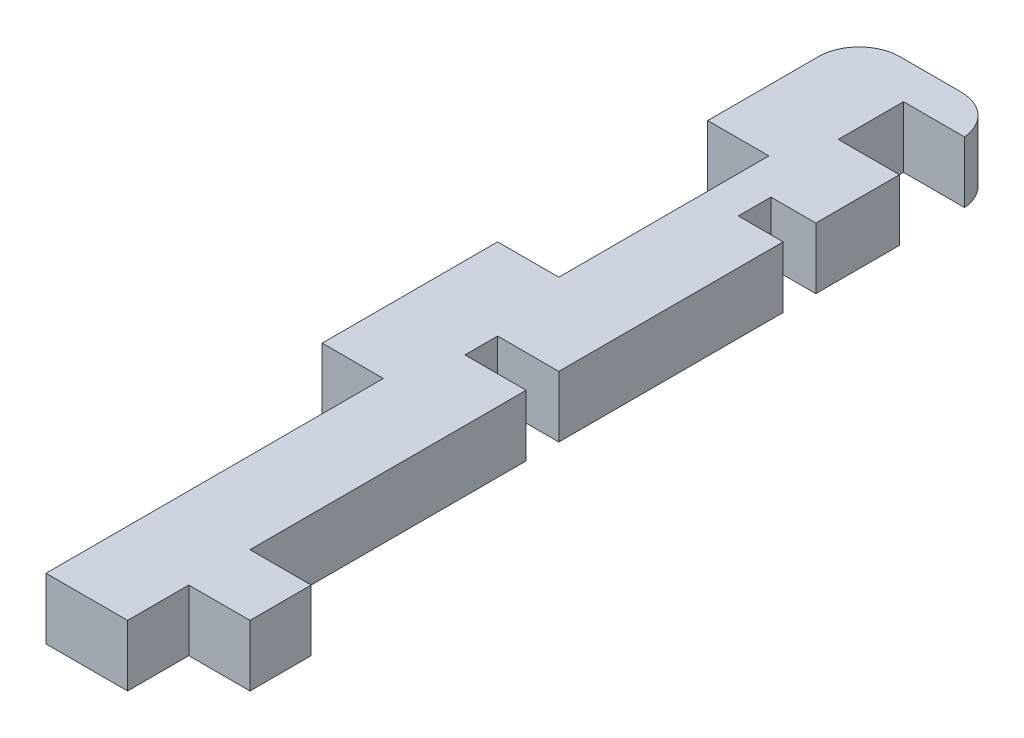
ISO-10303-21;
HEADER;
FILE_DESCRIPTION(('STEP AP214'),'2;1');
FILE_NAME('part.step','',(''),(''),'','','');
FILE_SCHEMA(('AUTOMOTIVE_DESIGN { 1 0 10303 214 1 1 1 1 }'));
ENDSEC;
DATA;
#1=APPLICATION_CONTEXT('core data for automotive mechanical design processes');
#2=APPLICATION_PROTOCOL_DEFINITION('international standard','automotive_design',2000,#1);
#3=PRODUCT_CONTEXT('',#1,'mechanical');
#4=PRODUCT('Part','Part','',(#3));
#5=PRODUCT_RELATED_PRODUCT_CATEGORY('part','',(#4));
#6=PRODUCT_DEFINITION_FORMATION('','',#4);
#7=PRODUCT_DEFINITION_CONTEXT('part definition',#1,'design');
#8=PRODUCT_DEFINITION('design','',#6,#7);
#9=PRODUCT_DEFINITION_SHAPE('','',#8);
#10=(LENGTH_UNIT() NAMED_UNIT(*) SI_UNIT(.MILLI.,.METRE.));
#11=(NAMED_UNIT(*) PLANE_ANGLE_UNIT() SI_UNIT($,.RADIAN.));
#12=(NAMED_UNIT(*) SI_UNIT($,.STERADIAN.) SOLID_ANGLE_UNIT());
#13=UNCERTAINTY_MEASURE_WITH_UNIT(LENGTH_MEASURE(1.E-05),#10,'distance_accuracy_value','');
#14=(GEOMETRIC_REPRESENTATION_CONTEXT(3) GLOBAL_UNCERTAINTY_ASSIGNED_CONTEXT((#13)) GLOBAL_UNIT_ASSIGNED_CONTEXT((#10,
#11,#12)) REPRESENTATION_CONTEXT('',''));
#15=CARTESIAN_POINT('',(0.,0.,0.));
#16=DIRECTION('',(0.,0.,1.));
#17=DIRECTION('',(1.,0.,0.));
#18=AXIS2_PLACEMENT_3D('',#15,#16,#17);
#19=CARTESIAN_POINT('',(-3.99999999999999,55.,3.3012479750596));
#20=DIRECTION('',(1.,0.,0.));
#21=DIRECTION('',(0.,0.,-1.));
#22=AXIS2_PLACEMENT_3D('',#19,#20,#21);
#23=PLANE('',#22);
#24=DIRECTION('',(0.,0.,-1.));
#25=VECTOR('',#24,1.);
#26=CARTESIAN_POINT('',(-3.99999999999999,58.,3.3012479750596));
#27=LINE('',#26,#25);
#28=CARTESIAN_POINT('',(-3.99999999999999,58.,4.6));
#29=VERTEX_POINT('',#28);
#30=CARTESIAN_POINT('',(-3.99999999999999,58.,-4.));
#31=VERTEX_POINT('',#30);
#32=EDGE_CURVE('E309',#29,#31,#27,.T.);
#33=ORIENTED_EDGE('',*,*,#32,.T.);
#34=DIRECTION('',(0.,1.,0.));
#35=VECTOR('',#34,1.);
#36=CARTESIAN_POINT('',(-3.99999999999999,55.,-4.));
#37=LINE('',#36,#35);
#38=CARTESIAN_POINT('',(-3.99999999999999,55.,-4.));
#39=VERTEX_POINT('',#38);
#40=EDGE_CURVE('E398',#39,#31,#37,.T.);
#41=ORIENTED_EDGE('',*,*,#40,.F.);
#42=DIRECTION('',(0.,0.,-1.));
#43=VECTOR('',#42,1.);
#44=CARTESIAN_POINT('',(-3.99999999999999,55.,3.3012479750596));
#45=LINE('',#44,#43);
#46=CARTESIAN_POINT('',(-3.99999999999999,55.,4.6));
#47=VERTEX_POINT('',#46);
#48=EDGE_CURVE('E310',#47,#39,#45,.T.);
#49=ORIENTED_EDGE('',*,*,#48,.F.);
#50=DIRECTION('',(0.,1.,0.));
#51=VECTOR('',#50,1.);
#52=CARTESIAN_POINT('',(-3.99999999999999,33.0497927116849,4.6));
#53=LINE('',#52,#51);
#54=EDGE_CURVE('E289',#47,#29,#53,.T.);
#55=ORIENTED_EDGE('',*,*,#54,.T.);
#56=EDGE_LOOP('',(#33,#41,#49,#55));
#57=FACE_BOUND('',#56,.T.);
#58=ADVANCED_FACE('F32',(#57),#23,.F.);
#59=CARTESIAN_POINT('',(-3.99999999999999,55.,-4.));
#60=DIRECTION('',(0.,0.,1.));
#61=DIRECTION('',(1.,0.,0.));
#62=AXIS2_PLACEMENT_3D('',#59,#60,#61);
#63=PLANE('',#62);
#64=DIRECTION('',(1.,0.,0.));
#65=VECTOR('',#64,1.);
#66=CARTESIAN_POINT('',(-3.99999999999999,58.,-4.));
#67=LINE('',#66,#65);
#68=CARTESIAN_POINT('',(-0.999999999999992,58.,-4.));
#69=VERTEX_POINT('',#68);
#70=EDGE_CURVE('E345',#31,#69,#67,.T.);
#71=ORIENTED_EDGE('',*,*,#70,.T.);
#72=DIRECTION('',(0.,1.,0.));
#73=VECTOR('',#72,1.);
#74=CARTESIAN_POINT('',(-0.999999999999993,55.,-4.));
#75=LINE('',#74,#73);
#76=CARTESIAN_POINT('',(-0.999999999999993,55.,-4.));
#77=VERTEX_POINT('',#76);
#78=EDGE_CURVE('E395',#77,#69,#75,.T.);
#79=ORIENTED_EDGE('',*,*,#78,.F.);
#80=DIRECTION('',(1.,0.,0.));
#81=VECTOR('',#80,1.);
#82=CARTESIAN_POINT('',(-3.99999999999999,55.,-4.));
#83=LINE('',#82,#81);
#84=EDGE_CURVE('E313',#39,#77,#83,.T.);
#85=ORIENTED_EDGE('',*,*,#84,.F.);
#86=ORIENTED_EDGE('',*,*,#40,.T.);
#87=EDGE_LOOP('',(#71,#79,#85,#86));
#88=FACE_BOUND('',#87,.T.);
#89=ADVANCED_FACE('F442',(#88),#63,.F.);
#90=CARTESIAN_POINT('',(-0.999999999999993,55.,-4.));
#91=DIRECTION('',(1.,0.,0.));
#92=DIRECTION('',(0.,1.,0.));
#93=AXIS2_PLACEMENT_3D('',#90,#91,#92);
#94=PLANE('',#93);
#95=DIRECTION('',(0.,0.,-1.));
#96=VECTOR('',#95,1.);
#97=CARTESIAN_POINT('',(-0.999999999999992,58.,-4.));
#98=LINE('',#97,#96);
#99=CARTESIAN_POINT('',(-0.999999999999992,58.,-14.3));
#100=VERTEX_POINT('',#99);
#101=EDGE_CURVE('E347',#69,#100,#98,.T.);
#102=ORIENTED_EDGE('',*,*,#101,.T.);
#103=DIRECTION('',(0.,1.,0.));
#104=VECTOR('',#103,1.);
#105=CARTESIAN_POINT('',(-0.999999999999993,55.,-14.3));
#106=LINE('',#105,#104);
#107=CARTESIAN_POINT('',(-0.999999999999993,55.,-14.3));
#108=VERTEX_POINT('',#107);
#109=EDGE_CURVE('E392',#108,#100,#106,.T.);
#110=ORIENTED_EDGE('',*,*,#109,.F.);
#111=DIRECTION('',(0.,0.,-1.));
#112=VECTOR('',#111,1.);
#113=CARTESIAN_POINT('',(-0.999999999999993,55.,-4.));
#114=LINE('',#113,#112);
#115=EDGE_CURVE('E316',#77,#108,#114,.T.);
#116=ORIENTED_EDGE('',*,*,#115,.F.);
#117=ORIENTED_EDGE('',*,*,#78,.T.);
#118=EDGE_LOOP('',(#102,#110,#116,#117));
#119=FACE_BOUND('',#118,.T.);
#120=ADVANCED_FACE('F438',(#119),#94,.F.);
#121=CARTESIAN_POINT('',(-0.999999999999993,55.,-14.3));
#122=DIRECTION('',(0.,0.,-1.));
#123=DIRECTION('',(-1.,0.,0.));
#124=AXIS2_PLACEMENT_3D('',#121,#122,#123);
#125=PLANE('',#124);
#126=DIRECTION('',(-1.,0.,0.));
#127=VECTOR('',#126,1.);
#128=CARTESIAN_POINT('',(-0.999999999999992,58.,-14.3));
#129=LINE('',#128,#127);
#130=CARTESIAN_POINT('',(-3.99999999999999,58.,-14.3));
#131=VERTEX_POINT('',#130);
#132=EDGE_CURVE('E349',#100,#131,#129,.T.);
#133=ORIENTED_EDGE('',*,*,#132,.T.);
#134=DIRECTION('',(0.,1.,0.));
#135=VECTOR('',#134,1.);
#136=CARTESIAN_POINT('',(-3.99999999999999,55.,-14.3));
#137=LINE('',#136,#135);
#138=CARTESIAN_POINT('',(-3.99999999999999,55.,-14.3));
#139=VERTEX_POINT('',#138);
#140=EDGE_CURVE('E389',#139,#131,#137,.T.);
#141=ORIENTED_EDGE('',*,*,#140,.F.);
#142=DIRECTION('',(-1.,0.,0.));
#143=VECTOR('',#142,1.);
#144=CARTESIAN_POINT('',(-0.999999999999993,55.,-14.3));
#145=LINE('',#144,#143);
#146=EDGE_CURVE('E318',#108,#139,#145,.T.);
#147=ORIENTED_EDGE('',*,*,#146,.F.);
#148=ORIENTED_EDGE('',*,*,#109,.T.);
#149=EDGE_LOOP('',(#133,#141,#147,#148));
#150=FACE_BOUND('',#149,.T.);
#151=ADVANCED_FACE('F434',(#150),#125,.F.);
#152=CARTESIAN_POINT('',(-3.99999999999999,55.,-14.3));
#153=DIRECTION('',(1.,0.,0.));
#154=DIRECTION('',(0.,1.,0.));
#155=AXIS2_PLACEMENT_3D('',#152,#153,#154);
#156=PLANE('',#155);
#157=DIRECTION('',(0.,0.,-1.));
#158=VECTOR('',#157,1.);
#159=CARTESIAN_POINT('',(-3.99999999999999,58.,-14.3));
#160=LINE('',#159,#158);
#161=CARTESIAN_POINT('',(-3.99999999999999,58.,-19.7231702245226));
#162=VERTEX_POINT('',#161);
#163=EDGE_CURVE('E351',#131,#162,#160,.T.);
#164=ORIENTED_EDGE('',*,*,#163,.T.);
#165=DIRECTION('',(0.,1.,0.));
#166=VECTOR('',#165,1.);
#167=CARTESIAN_POINT('',(-3.99999999999999,55.,-19.7231702245226));
#168=LINE('',#167,#166);
#169=CARTESIAN_POINT('',(-3.99999999999999,55.,-19.7231702245226));
#170=VERTEX_POINT('',#169);
#171=EDGE_CURVE('E55',#162,#170,#168,.F.);
#172=ORIENTED_EDGE('',*,*,#171,.T.);
#173=DIRECTION('',(0.,0.,-1.));
#174=VECTOR('',#173,1.);
#175=CARTESIAN_POINT('',(-3.99999999999999,55.,-14.3));
#176=LINE('',#175,#174);
#177=EDGE_CURVE('E320',#139,#170,#176,.T.);
#178=ORIENTED_EDGE('',*,*,#177,.F.);
#179=ORIENTED_EDGE('',*,*,#140,.T.);
#180=EDGE_LOOP('',(#164,#172,#178,#179));
#181=FACE_BOUND('',#180,.T.);
#182=ADVANCED_FACE('F430',(#181),#156,.F.);
#183=CARTESIAN_POINT('',(-3.99999999999999,55.,-21.7231702245226));
#184=DIRECTION('',(0.,0.,1.));
#185=DIRECTION('',(1.,0.,0.));
#186=AXIS2_PLACEMENT_3D('',#183,#184,#185);
#187=PLANE('',#186);
#188=DIRECTION('',(1.,0.,0.));
#189=VECTOR('',#188,1.);
#190=CARTESIAN_POINT('',(-3.99999999999999,55.,-21.7231702245226));
#191=LINE('',#190,#189);
#192=CARTESIAN_POINT('',(-1.99999999999999,55.,-21.7231702245226));
#193=VERTEX_POINT('',#192);
#194=CARTESIAN_POINT('',(1.00147624842734,55.,-21.7231702245226));
#195=VERTEX_POINT('',#194);
#196=EDGE_CURVE('E322',#193,#195,#191,.T.);
#197=ORIENTED_EDGE('',*,*,#196,.F.);
#198=DIRECTION('',(0.,1.,0.));
#199=VECTOR('',#198,1.);
#200=CARTESIAN_POINT('',(-1.99999999999999,55.,-21.7231702245226));
#201=LINE('',#200,#199);
#202=CARTESIAN_POINT('',(-1.99999999999999,58.,-21.7231702245226));
#203=VERTEX_POINT('',#202);
#204=EDGE_CURVE('E403',#193,#203,#201,.T.);
#205=ORIENTED_EDGE('',*,*,#204,.T.);
#206=DIRECTION('',(1.,0.,0.));
#207=VECTOR('',#206,1.);
#208=CARTESIAN_POINT('',(-3.99999999999999,58.,-21.7231702245226));
#209=LINE('',#208,#207);
#210=CARTESIAN_POINT('',(1.00147624842734,58.,-21.7231702245226));
#211=VERTEX_POINT('',#210);
#212=EDGE_CURVE('E224',#203,#211,#209,.T.);
#213=ORIENTED_EDGE('',*,*,#212,.T.);
#214=DIRECTION('',(0.,-1.,0.));
#215=VECTOR('',#214,1.);
#216=CARTESIAN_POINT('',(1.00147624842734,55.,-21.7231702245226));
#217=LINE('',#216,#215);
#218=EDGE_CURVE('E401',#211,#195,#217,.T.);
#219=ORIENTED_EDGE('',*,*,#218,.T.);
#220=EDGE_LOOP('',(#197,#205,#213,#219));
#221=FACE_BOUND('',#220,.T.);
#222=ADVANCED_FACE('F424',(#221),#187,.F.);
#223=CARTESIAN_POINT('',(0.,55.,-19.8));
#224=DIRECTION('',(-1.,0.,0.));
#225=DIRECTION('',(0.,-1.,0.));
#226=AXIS2_PLACEMENT_3D('',#223,#224,#225);
#227=PLANE('',#226);
#228=DIRECTION('',(0.,0.,1.));
#229=VECTOR('',#228,1.);
#230=CARTESIAN_POINT('',(0.,58.,-19.8));
#231=LINE('',#230,#229);
#232=CARTESIAN_POINT('',(0.,58.,-19.9));
#233=VERTEX_POINT('',#232);
#234=CARTESIAN_POINT('',(0.,58.,-16.7));
#235=VERTEX_POINT('',#234);
#236=EDGE_CURVE('E213',#233,#235,#231,.T.);
#237=ORIENTED_EDGE('',*,*,#236,.T.);
#238=DIRECTION('',(0.,-1.,0.));
#239=VECTOR('',#238,1.);
#240=CARTESIAN_POINT('',(0.,72.14,-16.7));
#241=LINE('',#240,#239);
#242=CARTESIAN_POINT('',(0.,55.,-16.7));
#243=VERTEX_POINT('',#242);
#244=EDGE_CURVE('E232',#235,#243,#241,.T.);
#245=ORIENTED_EDGE('',*,*,#244,.T.);
#246=DIRECTION('',(0.,0.,1.));
#247=VECTOR('',#246,1.);
#248=CARTESIAN_POINT('',(0.,55.,-19.8));
#249=LINE('',#248,#247);
#250=CARTESIAN_POINT('',(0.,55.,-19.9));
#251=VERTEX_POINT('',#250);
#252=EDGE_CURVE('E231',#251,#243,#249,.T.);
#253=ORIENTED_EDGE('',*,*,#252,.F.);
#254=DIRECTION('',(0.,-1.,0.));
#255=VECTOR('',#254,1.);
#256=CARTESIAN_POINT('',(0.,72.14,-19.9));
#257=LINE('',#256,#255);
#258=EDGE_CURVE('E227',#233,#251,#257,.T.);
#259=ORIENTED_EDGE('',*,*,#258,.F.);
#260=EDGE_LOOP('',(#237,#245,#253,#259));
#261=FACE_BOUND('',#260,.T.);
#262=ADVANCED_FACE('F230',(#261),#227,.F.);
#263=CARTESIAN_POINT('',(3.00000000000001,55.,-16.8));
#264=DIRECTION('',(-1.,0.,0.));
#265=DIRECTION('',(0.,-1.,0.));
#266=AXIS2_PLACEMENT_3D('',#263,#264,#265);
#267=PLANE('',#266);
#268=DIRECTION('',(0.,0.,1.));
#269=VECTOR('',#268,1.);
#270=CARTESIAN_POINT('',(3.00000000000001,55.,-16.8));
#271=LINE('',#270,#269);
#272=CARTESIAN_POINT('',(3.,55.,-16.7));
#273=VERTEX_POINT('',#272);
#274=CARTESIAN_POINT('',(3.00000000000001,55.,-12.6));
#275=VERTEX_POINT('',#274);
#276=EDGE_CURVE('E326',#273,#275,#271,.T.);
#277=ORIENTED_EDGE('',*,*,#276,.F.);
#278=DIRECTION('',(0.,-1.,0.));
#279=VECTOR('',#278,1.);
#280=CARTESIAN_POINT('',(3.,72.14,-16.7));
#281=LINE('',#280,#279);
#282=CARTESIAN_POINT('',(3.,58.,-16.7));
#283=VERTEX_POINT('',#282);
#284=EDGE_CURVE('E228',#283,#273,#281,.T.);
#285=ORIENTED_EDGE('',*,*,#284,.F.);
#286=DIRECTION('',(0.,0.,1.));
#287=VECTOR('',#286,1.);
#288=CARTESIAN_POINT('',(3.00000000000001,58.,-16.8));
#289=LINE('',#288,#287);
#290=CARTESIAN_POINT('',(3.00000000000001,58.,-12.6));
#291=VERTEX_POINT('',#290);
#292=EDGE_CURVE('E223',#283,#291,#289,.T.);
#293=ORIENTED_EDGE('',*,*,#292,.T.);
#294=DIRECTION('',(0.,1.,0.));
#295=VECTOR('',#294,1.);
#296=CARTESIAN_POINT('',(3.00000000000001,55.,-12.6));
#297=LINE('',#296,#295);
#298=EDGE_CURVE('E386',#275,#291,#297,.T.);
#299=ORIENTED_EDGE('',*,*,#298,.F.);
#300=EDGE_LOOP('',(#277,#285,#293,#299));
#301=FACE_BOUND('',#300,.T.);
#302=ADVANCED_FACE('F516',(#301),#267,.F.);
#303=CARTESIAN_POINT('',(3.00000000000001,55.,-12.6));
#304=DIRECTION('',(0.,0.,-1.));
#305=DIRECTION('',(-1.,0.,0.));
#306=AXIS2_PLACEMENT_3D('',#303,#304,#305);
#307=PLANE('',#306);
#308=DIRECTION('',(-1.,0.,0.));
#309=VECTOR('',#308,1.);
#310=CARTESIAN_POINT('',(3.00000000000001,58.,-12.6));
#311=LINE('',#310,#309);
#312=CARTESIAN_POINT('',(0.8,58.,-12.6));
#313=VERTEX_POINT('',#312);
#314=EDGE_CURVE('E356',#291,#313,#311,.T.);
#315=ORIENTED_EDGE('',*,*,#314,.T.);
#316=DIRECTION('',(0.,1.,0.));
#317=VECTOR('',#316,1.);
#318=CARTESIAN_POINT('',(0.8,55.,-12.6));
#319=LINE('',#318,#317);
#320=CARTESIAN_POINT('',(0.8,55.,-12.6));
#321=VERTEX_POINT('',#320);
#322=EDGE_CURVE('E383',#321,#313,#319,.T.);
#323=ORIENTED_EDGE('',*,*,#322,.F.);
#324=DIRECTION('',(-1.,0.,0.));
#325=VECTOR('',#324,1.);
#326=CARTESIAN_POINT('',(3.00000000000001,55.,-12.6));
#327=LINE('',#326,#325);
#328=EDGE_CURVE('E328',#275,#321,#327,.T.);
#329=ORIENTED_EDGE('',*,*,#328,.F.);
#330=ORIENTED_EDGE('',*,*,#298,.T.);
#331=EDGE_LOOP('',(#315,#323,#329,#330));
#332=FACE_BOUND('',#331,.T.);
#333=ADVANCED_FACE('F511',(#332),#307,.F.);
#334=CARTESIAN_POINT('',(0.8,55.,-12.6));
#335=DIRECTION('',(-1.,0.,0.));
#336=DIRECTION('',(0.,-1.,0.));
#337=AXIS2_PLACEMENT_3D('',#334,#335,#336);
#338=PLANE('',#337);
#339=DIRECTION('',(0.,0.,1.));
#340=VECTOR('',#339,1.);
#341=CARTESIAN_POINT('',(0.8,58.,-12.6));
#342=LINE('',#341,#340);
#343=CARTESIAN_POINT('',(0.8,58.,-11.));
#344=VERTEX_POINT('',#343);
#345=EDGE_CURVE('E358',#313,#344,#342,.T.);
#346=ORIENTED_EDGE('',*,*,#345,.T.);
#347=DIRECTION('',(0.,1.,0.));
#348=VECTOR('',#347,1.);
#349=CARTESIAN_POINT('',(0.8,55.,-11.));
#350=LINE('',#349,#348);
#351=CARTESIAN_POINT('',(0.8,55.,-11.));
#352=VERTEX_POINT('',#351);
#353=EDGE_CURVE('E380',#352,#344,#350,.T.);
#354=ORIENTED_EDGE('',*,*,#353,.F.);
#355=DIRECTION('',(0.,0.,1.));
#356=VECTOR('',#355,1.);
#357=CARTESIAN_POINT('',(0.8,55.,-12.6));
#358=LINE('',#357,#356);
#359=EDGE_CURVE('E330',#321,#352,#358,.T.);
#360=ORIENTED_EDGE('',*,*,#359,.F.);
#361=ORIENTED_EDGE('',*,*,#322,.T.);
#362=EDGE_LOOP('',(#346,#354,#360,#361));
#363=FACE_BOUND('',#362,.T.);
#364=ADVANCED_FACE('F507',(#363),#338,.F.);
#365=CARTESIAN_POINT('',(0.8,55.,-11.));
#366=DIRECTION('',(0.,0.,1.));
#367=DIRECTION('',(1.,0.,0.));
#368=AXIS2_PLACEMENT_3D('',#365,#366,#367);
#369=PLANE('',#368);
#370=DIRECTION('',(1.,0.,0.));
#371=VECTOR('',#370,1.);
#372=CARTESIAN_POINT('',(0.8,58.,-11.));
#373=LINE('',#372,#371);
#374=CARTESIAN_POINT('',(3.00000000000001,58.,-11.));
#375=VERTEX_POINT('',#374);
#376=EDGE_CURVE('E360',#344,#375,#373,.T.);
#377=ORIENTED_EDGE('',*,*,#376,.T.);
#378=DIRECTION('',(0.,1.,0.));
#379=VECTOR('',#378,1.);
#380=CARTESIAN_POINT('',(3.00000000000001,55.,-11.));
#381=LINE('',#380,#379);
#382=CARTESIAN_POINT('',(3.00000000000001,55.,-11.));
#383=VERTEX_POINT('',#382);
#384=EDGE_CURVE('E377',#383,#375,#381,.T.);
#385=ORIENTED_EDGE('',*,*,#384,.F.);
#386=DIRECTION('',(1.,0.,0.));
#387=VECTOR('',#386,1.);
#388=CARTESIAN_POINT('',(0.8,55.,-11.));
#389=LINE('',#388,#387);
#390=EDGE_CURVE('E332',#352,#383,#389,.T.);
#391=ORIENTED_EDGE('',*,*,#390,.F.);
#392=ORIENTED_EDGE('',*,*,#353,.T.);
#393=EDGE_LOOP('',(#377,#385,#391,#392));
#394=FACE_BOUND('',#393,.T.);
#395=ADVANCED_FACE('F503',(#394),#369,.F.);
#396=CARTESIAN_POINT('',(3.00000000000001,55.,-11.));
#397=DIRECTION('',(-1.,0.,0.));
#398=DIRECTION('',(0.,-1.,0.));
#399=AXIS2_PLACEMENT_3D('',#396,#397,#398);
#400=PLANE('',#399);
#401=DIRECTION('',(0.,0.,1.));
#402=VECTOR('',#401,1.);
#403=CARTESIAN_POINT('',(3.00000000000001,58.,-11.));
#404=LINE('',#403,#402);
#405=CARTESIAN_POINT('',(3.00000000000001,58.,0.));
#406=VERTEX_POINT('',#405);
#407=EDGE_CURVE('E362',#375,#406,#404,.T.);
#408=ORIENTED_EDGE('',*,*,#407,.T.);
#409=DIRECTION('',(0.,1.,0.));
#410=VECTOR('',#409,1.);
#411=CARTESIAN_POINT('',(3.00000000000001,55.,0.));
#412=LINE('',#411,#410);
#413=CARTESIAN_POINT('',(3.00000000000001,55.,0.));
#414=VERTEX_POINT('',#413);
#415=EDGE_CURVE('E374',#414,#406,#412,.T.);
#416=ORIENTED_EDGE('',*,*,#415,.F.);
#417=DIRECTION('',(0.,0.,1.));
#418=VECTOR('',#417,1.);
#419=CARTESIAN_POINT('',(3.00000000000001,55.,-11.));
#420=LINE('',#419,#418);
#421=EDGE_CURVE('E334',#383,#414,#420,.T.);
#422=ORIENTED_EDGE('',*,*,#421,.F.);
#423=ORIENTED_EDGE('',*,*,#384,.T.);
#424=EDGE_LOOP('',(#408,#416,#422,#423));
#425=FACE_BOUND('',#424,.T.);
#426=ADVANCED_FACE('F498',(#425),#400,.F.);
#427=CARTESIAN_POINT('',(3.00000000000001,55.,0.));
#428=DIRECTION('',(0.,0.,-1.));
#429=DIRECTION('',(-1.,0.,0.));
#430=AXIS2_PLACEMENT_3D('',#427,#428,#429);
#431=PLANE('',#430);
#432=DIRECTION('',(-1.,0.,0.));
#433=VECTOR('',#432,1.);
#434=CARTESIAN_POINT('',(3.00000000000001,58.,0.));
#435=LINE('',#434,#433);
#436=CARTESIAN_POINT('',(0.,58.,0.));
#437=VERTEX_POINT('',#436);
#438=EDGE_CURVE('E364',#406,#437,#435,.T.);
#439=ORIENTED_EDGE('',*,*,#438,.T.);
#440=DIRECTION('',(0.,1.,0.));
#441=VECTOR('',#440,1.);
#442=CARTESIAN_POINT('',(0.,55.,0.));
#443=LINE('',#442,#441);
#444=CARTESIAN_POINT('',(0.,55.,0.));
#445=VERTEX_POINT('',#444);
#446=EDGE_CURVE('E371',#445,#437,#443,.T.);
#447=ORIENTED_EDGE('',*,*,#446,.F.);
#448=DIRECTION('',(-1.,0.,0.));
#449=VECTOR('',#448,1.);
#450=CARTESIAN_POINT('',(3.00000000000001,55.,0.));
#451=LINE('',#450,#449);
#452=EDGE_CURVE('E336',#414,#445,#451,.T.);
#453=ORIENTED_EDGE('',*,*,#452,.F.);
#454=ORIENTED_EDGE('',*,*,#415,.T.);
#455=EDGE_LOOP('',(#439,#447,#453,#454));
#456=FACE_BOUND('',#455,.T.);
#457=ADVANCED_FACE('F492',(#456),#431,.F.);
#458=CARTESIAN_POINT('',(0.,55.,0.));
#459=DIRECTION('',(-1.,0.,0.));
#460=DIRECTION('',(0.,-1.,0.));
#461=AXIS2_PLACEMENT_3D('',#458,#459,#460);
#462=PLANE('',#461);
#463=DIRECTION('',(0.,0.,1.));
#464=VECTOR('',#463,1.);
#465=CARTESIAN_POINT('',(0.,58.,0.));
#466=LINE('',#465,#464);
#467=CARTESIAN_POINT('',(0.,58.,1.6));
#468=VERTEX_POINT('',#467);
#469=EDGE_CURVE('E366',#437,#468,#466,.T.);
#470=ORIENTED_EDGE('',*,*,#469,.T.);
#471=DIRECTION('',(0.,1.,0.));
#472=VECTOR('',#471,1.);
#473=CARTESIAN_POINT('',(0.,55.,1.6));
#474=LINE('',#473,#472);
#475=CARTESIAN_POINT('',(0.,55.,1.6));
#476=VERTEX_POINT('',#475);
#477=EDGE_CURVE('E342',#476,#468,#474,.T.);
#478=ORIENTED_EDGE('',*,*,#477,.F.);
#479=DIRECTION('',(0.,0.,1.));
#480=VECTOR('',#479,1.);
#481=CARTESIAN_POINT('',(0.,55.,0.));
#482=LINE('',#481,#480);
#483=EDGE_CURVE('E338',#445,#476,#482,.T.);
#484=ORIENTED_EDGE('',*,*,#483,.F.);
#485=ORIENTED_EDGE('',*,*,#446,.T.);
#486=EDGE_LOOP('',(#470,#478,#484,#485));
#487=FACE_BOUND('',#486,.T.);
#488=ADVANCED_FACE('F488',(#487),#462,.F.);
#489=CARTESIAN_POINT('',(0.,55.,1.6));
#490=DIRECTION('',(0.,0.,1.));
#491=DIRECTION('',(1.,0.,0.));
#492=AXIS2_PLACEMENT_3D('',#489,#490,#491);
#493=PLANE('',#492);
#494=DIRECTION('',(1.,0.,0.));
#495=VECTOR('',#494,1.);
#496=CARTESIAN_POINT('',(0.,58.,1.6));
#497=LINE('',#496,#495);
#498=CARTESIAN_POINT('',(3.00000000000001,58.,1.6));
#499=VERTEX_POINT('',#498);
#500=EDGE_CURVE('E314',#468,#499,#497,.T.);
#501=ORIENTED_EDGE('',*,*,#500,.T.);
#502=DIRECTION('',(0.,1.,0.));
#503=VECTOR('',#502,1.);
#504=CARTESIAN_POINT('',(3.00000000000001,33.0497927116849,1.6));
#505=LINE('',#504,#503);
#506=CARTESIAN_POINT('',(3.00000000000001,55.,1.6));
#507=VERTEX_POINT('',#506);
#508=EDGE_CURVE('E293',#507,#499,#505,.T.);
#509=ORIENTED_EDGE('',*,*,#508,.F.);
#510=DIRECTION('',(1.,0.,0.));
#511=VECTOR('',#510,1.);
#512=CARTESIAN_POINT('',(0.,55.,1.6));
#513=LINE('',#512,#511);
#514=EDGE_CURVE('E340',#476,#507,#513,.T.);
#515=ORIENTED_EDGE('',*,*,#514,.F.);
#516=ORIENTED_EDGE('',*,*,#477,.T.);
#517=EDGE_LOOP('',(#501,#509,#515,#516));
#518=FACE_BOUND('',#517,.T.);
#519=ADVANCED_FACE('F483',(#518),#493,.F.);
#520=CARTESIAN_POINT('',(0.,55.,0.));
#521=DIRECTION('',(0.,-1.,0.));
#522=DIRECTION('',(0.,0.,-1.));
#523=AXIS2_PLACEMENT_3D('',#520,#521,#522);
#524=PLANE('',#523);
#525=DIRECTION('',(-1.,0.,0.));
#526=VECTOR('',#525,1.);
#527=CARTESIAN_POINT('',(0.,55.,-16.7));
#528=LINE('',#527,#526);
#529=EDGE_CURVE('E238',#273,#243,#528,.T.);
#530=ORIENTED_EDGE('',*,*,#529,.F.);
#531=ORIENTED_EDGE('',*,*,#276,.T.);
#532=ORIENTED_EDGE('',*,*,#328,.T.);
#533=ORIENTED_EDGE('',*,*,#359,.T.);
#534=ORIENTED_EDGE('',*,*,#390,.T.);
#535=ORIENTED_EDGE('',*,*,#421,.T.);
#536=ORIENTED_EDGE('',*,*,#452,.T.);
#537=ORIENTED_EDGE('',*,*,#483,.T.);
#538=ORIENTED_EDGE('',*,*,#514,.T.);
#539=DIRECTION('',(0.,0.,-1.));
#540=VECTOR('',#539,1.);
#541=CARTESIAN_POINT('',(3.00000000000001,55.,15.14));
#542=LINE('',#541,#540);
#543=CARTESIAN_POINT('',(3.00000000000001,55.,15.14));
#544=VERTEX_POINT('',#543);
#545=EDGE_CURVE('E290',#544,#507,#542,.T.);
#546=ORIENTED_EDGE('',*,*,#545,.F.);
#547=DIRECTION('',(-1.,0.,0.));
#548=VECTOR('',#547,1.);
#549=CARTESIAN_POINT('',(6.00000000000001,55.,15.14));
#550=LINE('',#549,#548);
#551=CARTESIAN_POINT('',(6.00000000000001,55.,15.14));
#552=VERTEX_POINT('',#551);
#553=EDGE_CURVE('E295',#552,#544,#550,.T.);
#554=ORIENTED_EDGE('',*,*,#553,.F.);
#555=DIRECTION('',(0.,0.,-1.));
#556=VECTOR('',#555,1.);
#557=CARTESIAN_POINT('',(6.00000000000001,55.,18.14));
#558=LINE('',#557,#556);
#559=CARTESIAN_POINT('',(6.00000000000001,55.,18.14));
#560=VERTEX_POINT('',#559);
#561=EDGE_CURVE('E245',#560,#552,#558,.T.);
#562=ORIENTED_EDGE('',*,*,#561,.F.);
#563=DIRECTION('',(1.,0.,0.));
#564=VECTOR('',#563,1.);
#565=CARTESIAN_POINT('',(3.00000000000001,55.,18.14));
#566=LINE('',#565,#564);
#567=CARTESIAN_POINT('',(3.00000000000001,55.,18.14));
#568=VERTEX_POINT('',#567);
#569=EDGE_CURVE('E269',#568,#560,#566,.T.);
#570=ORIENTED_EDGE('',*,*,#569,.F.);
#571=DIRECTION('',(0.,0.,-1.));
#572=VECTOR('',#571,1.);
#573=CARTESIAN_POINT('',(3.00000000000001,55.,21.14));
#574=LINE('',#573,#572);
#575=CARTESIAN_POINT('',(3.00000000000001,55.,21.14));
#576=VERTEX_POINT('',#575);
#577=EDGE_CURVE('E274',#576,#568,#574,.T.);
#578=ORIENTED_EDGE('',*,*,#577,.F.);
#579=DIRECTION('',(1.,0.,0.));
#580=VECTOR('',#579,1.);
#581=CARTESIAN_POINT('',(-0.999999999999999,55.,21.14));
#582=LINE('',#581,#580);
#583=CARTESIAN_POINT('',(-0.999999999999999,55.,21.14));
#584=VERTEX_POINT('',#583);
#585=EDGE_CURVE('E278',#584,#576,#582,.T.);
#586=ORIENTED_EDGE('',*,*,#585,.F.);
#587=DIRECTION('',(0.,0.,1.));
#588=VECTOR('',#587,1.);
#589=CARTESIAN_POINT('',(-0.999999999999999,55.,18.14));
#590=LINE('',#589,#588);
#591=CARTESIAN_POINT('',(-1.,55.,4.6));
#592=VERTEX_POINT('',#591);
#593=EDGE_CURVE('E282',#592,#584,#590,.T.);
#594=ORIENTED_EDGE('',*,*,#593,.F.);
#595=DIRECTION('',(1.,0.,0.));
#596=VECTOR('',#595,1.);
#597=CARTESIAN_POINT('',(-3.99999999999999,55.,4.6));
#598=LINE('',#597,#596);
#599=EDGE_CURVE('E286',#47,#592,#598,.T.);
#600=ORIENTED_EDGE('',*,*,#599,.F.);
#601=ORIENTED_EDGE('',*,*,#48,.T.);
#602=ORIENTED_EDGE('',*,*,#84,.T.);
#603=ORIENTED_EDGE('',*,*,#115,.T.);
#604=ORIENTED_EDGE('',*,*,#146,.T.);
#605=ORIENTED_EDGE('',*,*,#177,.T.);
#606=CARTESIAN_POINT('',(-1.99999999999999,55.,-19.7231702245226));
#607=DIRECTION('',(0.,-1.,0.));
#608=DIRECTION('',(0.,0.,-1.));
#609=AXIS2_PLACEMENT_3D('',#606,#607,#608);
#610=CIRCLE('',#609,2.);
#611=EDGE_CURVE('E414',#170,#193,#610,.T.);
#612=ORIENTED_EDGE('',*,*,#611,.T.);
#613=ORIENTED_EDGE('',*,*,#196,.T.);
#614=CARTESIAN_POINT('',(1.00147624842734,55.,-19.7231702245226));
#615=DIRECTION('',(0.,-1.,0.));
#616=DIRECTION('',(0.,0.,-1.));
#617=AXIS2_PLACEMENT_3D('',#614,#615,#616);
#618=CIRCLE('',#617,2.);
#619=CARTESIAN_POINT('',(2.99364371892389,55.,-19.9));
#620=VERTEX_POINT('',#619);
#621=EDGE_CURVE('E411',#195,#620,#618,.T.);
#622=ORIENTED_EDGE('',*,*,#621,.T.);
#623=DIRECTION('',(1.,0.,0.));
#624=VECTOR('',#623,1.);
#625=CARTESIAN_POINT('',(0.,55.,-19.9));
#626=LINE('',#625,#624);
#627=EDGE_CURVE('E47',#251,#620,#626,.T.);
#628=ORIENTED_EDGE('',*,*,#627,.F.);
#629=ORIENTED_EDGE('',*,*,#252,.T.);
#630=EDGE_LOOP('',(#530,#531,#532,#533,#534,#535,#536,#537,#538,#546,#554,#562,#570,#578,#586,
#594,#600,#601,#602,#603,#604,#605,#612,#613,#622,#628,#629));
#631=FACE_BOUND('',#630,.T.);
#632=ADVANCED_FACE('F419',(#631),#524,.T.);
#633=CARTESIAN_POINT('',(0.,58.,0.));
#634=DIRECTION('',(0.,-1.,0.));
#635=DIRECTION('',(0.,0.,-1.));
#636=AXIS2_PLACEMENT_3D('',#633,#634,#635);
#637=PLANE('',#636);
#638=ORIENTED_EDGE('',*,*,#292,.F.);
#639=DIRECTION('',(-1.,0.,0.));
#640=VECTOR('',#639,1.);
#641=CARTESIAN_POINT('',(0.,58.,-16.7));
#642=LINE('',#641,#640);
#643=EDGE_CURVE('E11',#283,#235,#642,.T.);
#644=ORIENTED_EDGE('',*,*,#643,.T.);
#645=ORIENTED_EDGE('',*,*,#236,.F.);
#646=DIRECTION('',(1.,0.,0.));
#647=VECTOR('',#646,1.);
#648=CARTESIAN_POINT('',(0.,58.,-19.9));
#649=LINE('',#648,#647);
#650=CARTESIAN_POINT('',(2.99364371892389,58.,-19.9));
#651=VERTEX_POINT('',#650);
#652=EDGE_CURVE('E217',#233,#651,#649,.T.);
#653=ORIENTED_EDGE('',*,*,#652,.T.);
#654=CARTESIAN_POINT('',(1.00147624842734,58.,-19.7231702245226));
#655=DIRECTION('',(0.,-1.,0.));
#656=DIRECTION('',(0.,0.,-1.));
#657=AXIS2_PLACEMENT_3D('',#654,#655,#656);
#658=CIRCLE('',#657,2.);
#659=EDGE_CURVE('E406',#651,#211,#658,.F.);
#660=ORIENTED_EDGE('',*,*,#659,.T.);
#661=ORIENTED_EDGE('',*,*,#212,.F.);
#662=CARTESIAN_POINT('',(-1.99999999999999,58.,-19.7231702245226));
#663=DIRECTION('',(0.,-1.,0.));
#664=DIRECTION('',(0.,0.,-1.));
#665=AXIS2_PLACEMENT_3D('',#662,#663,#664);
#666=CIRCLE('',#665,2.);
#667=EDGE_CURVE('E408',#203,#162,#666,.F.);
#668=ORIENTED_EDGE('',*,*,#667,.T.);
#669=ORIENTED_EDGE('',*,*,#163,.F.);
#670=ORIENTED_EDGE('',*,*,#132,.F.);
#671=ORIENTED_EDGE('',*,*,#101,.F.);
#672=ORIENTED_EDGE('',*,*,#70,.F.);
#673=ORIENTED_EDGE('',*,*,#32,.F.);
#674=DIRECTION('',(1.,0.,0.));
#675=VECTOR('',#674,1.);
#676=CARTESIAN_POINT('',(-3.99999999999999,58.,4.6));
#677=LINE('',#676,#675);
#678=CARTESIAN_POINT('',(-1.,58.,4.6));
#679=VERTEX_POINT('',#678);
#680=EDGE_CURVE('E252',#29,#679,#677,.T.);
#681=ORIENTED_EDGE('',*,*,#680,.T.);
#682=DIRECTION('',(0.,0.,1.));
#683=VECTOR('',#682,1.);
#684=CARTESIAN_POINT('',(-0.999999999999999,58.,18.14));
#685=LINE('',#684,#683);
#686=CARTESIAN_POINT('',(-0.999999999999999,58.,21.14));
#687=VERTEX_POINT('',#686);
#688=EDGE_CURVE('E249',#679,#687,#685,.T.);
#689=ORIENTED_EDGE('',*,*,#688,.T.);
#690=DIRECTION('',(1.,0.,0.));
#691=VECTOR('',#690,1.);
#692=CARTESIAN_POINT('',(-0.999999999999999,58.,21.14));
#693=LINE('',#692,#691);
#694=CARTESIAN_POINT('',(3.00000000000001,58.,21.14));
#695=VERTEX_POINT('',#694);
#696=EDGE_CURVE('E246',#687,#695,#693,.T.);
#697=ORIENTED_EDGE('',*,*,#696,.T.);
#698=DIRECTION('',(0.,0.,-1.));
#699=VECTOR('',#698,1.);
#700=CARTESIAN_POINT('',(3.00000000000001,58.,21.14));
#701=LINE('',#700,#699);
#702=CARTESIAN_POINT('',(3.00000000000001,58.,18.14));
#703=VERTEX_POINT('',#702);
#704=EDGE_CURVE('E242',#695,#703,#701,.T.);
#705=ORIENTED_EDGE('',*,*,#704,.T.);
#706=DIRECTION('',(1.,0.,0.));
#707=VECTOR('',#706,1.);
#708=CARTESIAN_POINT('',(3.00000000000001,58.,18.14));
#709=LINE('',#708,#707);
#710=CARTESIAN_POINT('',(6.00000000000001,58.,18.14));
#711=VERTEX_POINT('',#710);
#712=EDGE_CURVE('E241',#703,#711,#709,.T.);
#713=ORIENTED_EDGE('',*,*,#712,.T.);
#714=DIRECTION('',(0.,0.,-1.));
#715=VECTOR('',#714,1.);
#716=CARTESIAN_POINT('',(6.00000000000001,58.,18.14));
#717=LINE('',#716,#715);
#718=CARTESIAN_POINT('',(6.00000000000001,58.,15.14));
#719=VERTEX_POINT('',#718);
#720=EDGE_CURVE('E261',#711,#719,#717,.T.);
#721=ORIENTED_EDGE('',*,*,#720,.T.);
#722=DIRECTION('',(-1.,0.,0.));
#723=VECTOR('',#722,1.);
#724=CARTESIAN_POINT('',(6.00000000000001,58.,15.14));
#725=LINE('',#724,#723);
#726=CARTESIAN_POINT('',(3.00000000000001,58.,15.14));
#727=VERTEX_POINT('',#726);
#728=EDGE_CURVE('E258',#719,#727,#725,.T.);
#729=ORIENTED_EDGE('',*,*,#728,.T.);
#730=DIRECTION('',(0.,0.,-1.));
#731=VECTOR('',#730,1.);
#732=CARTESIAN_POINT('',(3.00000000000001,58.,15.14));
#733=LINE('',#732,#731);
#734=EDGE_CURVE('E255',#727,#499,#733,.T.);
#735=ORIENTED_EDGE('',*,*,#734,.T.);
#736=ORIENTED_EDGE('',*,*,#500,.F.);
#737=ORIENTED_EDGE('',*,*,#469,.F.);
#738=ORIENTED_EDGE('',*,*,#438,.F.);
#739=ORIENTED_EDGE('',*,*,#407,.F.);
#740=ORIENTED_EDGE('',*,*,#376,.F.);
#741=ORIENTED_EDGE('',*,*,#345,.F.);
#742=ORIENTED_EDGE('',*,*,#314,.F.);
#743=EDGE_LOOP('',(#638,#644,#645,#653,#660,#661,#668,#669,#670,#671,#672,#673,#681,#689,#697,
#705,#713,#721,#729,#735,#736,#737,#738,#739,#740,#741,#742));
#744=FACE_BOUND('',#743,.T.);
#745=ADVANCED_FACE('F216',(#744),#637,.F.);
#746=CARTESIAN_POINT('',(6.00000000000001,33.0497927116849,18.14));
#747=DIRECTION('',(1.,0.,0.));
#748=DIRECTION('',(0.,0.,-1.));
#749=AXIS2_PLACEMENT_3D('',#746,#747,#748);
#750=PLANE('',#749);
#751=DIRECTION('',(0.,1.,0.));
#752=VECTOR('',#751,1.);
#753=CARTESIAN_POINT('',(6.00000000000001,33.0497927116849,18.14));
#754=LINE('',#753,#752);
#755=EDGE_CURVE('E272',#560,#711,#754,.T.);
#756=ORIENTED_EDGE('',*,*,#755,.F.);
#757=ORIENTED_EDGE('',*,*,#561,.T.);
#758=DIRECTION('',(0.,1.,0.));
#759=VECTOR('',#758,1.);
#760=CARTESIAN_POINT('',(6.00000000000001,33.0497927116849,15.14));
#761=LINE('',#760,#759);
#762=EDGE_CURVE('E268',#552,#719,#761,.T.);
#763=ORIENTED_EDGE('',*,*,#762,.T.);
#764=ORIENTED_EDGE('',*,*,#720,.F.);
#765=EDGE_LOOP('',(#756,#757,#763,#764));
#766=FACE_BOUND('',#765,.T.);
#767=ADVANCED_FACE('F470',(#766),#750,.T.);
#768=CARTESIAN_POINT('',(6.00000000000001,33.0497927116849,15.14));
#769=DIRECTION('',(0.,0.,-1.));
#770=DIRECTION('',(-1.,0.,0.));
#771=AXIS2_PLACEMENT_3D('',#768,#769,#770);
#772=PLANE('',#771);
#773=ORIENTED_EDGE('',*,*,#762,.F.);
#774=ORIENTED_EDGE('',*,*,#553,.T.);
#775=DIRECTION('',(0.,1.,0.));
#776=VECTOR('',#775,1.);
#777=CARTESIAN_POINT('',(3.00000000000001,33.0497927116849,15.14));
#778=LINE('',#777,#776);
#779=EDGE_CURVE('E294',#544,#727,#778,.T.);
#780=ORIENTED_EDGE('',*,*,#779,.T.);
#781=ORIENTED_EDGE('',*,*,#728,.F.);
#782=EDGE_LOOP('',(#773,#774,#780,#781));
#783=FACE_BOUND('',#782,.T.);
#784=ADVANCED_FACE('F473',(#783),#772,.T.);
#785=CARTESIAN_POINT('',(3.00000000000001,33.0497927116849,15.14));
#786=DIRECTION('',(1.,0.,0.));
#787=DIRECTION('',(0.,0.,-1.));
#788=AXIS2_PLACEMENT_3D('',#785,#786,#787);
#789=PLANE('',#788);
#790=ORIENTED_EDGE('',*,*,#779,.F.);
#791=ORIENTED_EDGE('',*,*,#545,.T.);
#792=ORIENTED_EDGE('',*,*,#508,.T.);
#793=ORIENTED_EDGE('',*,*,#734,.F.);
#794=EDGE_LOOP('',(#790,#791,#792,#793));
#795=FACE_BOUND('',#794,.T.);
#796=ADVANCED_FACE('F477',(#795),#789,.T.);
#797=CARTESIAN_POINT('',(-3.99999999999999,33.0497927116849,4.6));
#798=DIRECTION('',(0.,0.,1.));
#799=DIRECTION('',(1.,0.,0.));
#800=AXIS2_PLACEMENT_3D('',#797,#798,#799);
#801=PLANE('',#800);
#802=ORIENTED_EDGE('',*,*,#54,.F.);
#803=ORIENTED_EDGE('',*,*,#599,.T.);
#804=DIRECTION('',(0.,1.,0.));
#805=VECTOR('',#804,1.);
#806=CARTESIAN_POINT('',(-1.,33.0497927116849,4.6));
#807=LINE('',#806,#805);
#808=EDGE_CURVE('E285',#592,#679,#807,.T.);
#809=ORIENTED_EDGE('',*,*,#808,.T.);
#810=ORIENTED_EDGE('',*,*,#680,.F.);
#811=EDGE_LOOP('',(#802,#803,#809,#810));
#812=FACE_BOUND('',#811,.T.);
#813=ADVANCED_FACE('F449',(#812),#801,.T.);
#814=CARTESIAN_POINT('',(-0.999999999999999,33.0497927116849,18.14));
#815=DIRECTION('',(-1.,0.,0.));
#816=DIRECTION('',(0.,0.,1.));
#817=AXIS2_PLACEMENT_3D('',#814,#815,#816);
#818=PLANE('',#817);
#819=ORIENTED_EDGE('',*,*,#808,.F.);
#820=ORIENTED_EDGE('',*,*,#593,.T.);
#821=DIRECTION('',(0.,1.,0.));
#822=VECTOR('',#821,1.);
#823=CARTESIAN_POINT('',(-0.999999999999999,33.0497927116849,21.14));
#824=LINE('',#823,#822);
#825=EDGE_CURVE('E281',#584,#687,#824,.T.);
#826=ORIENTED_EDGE('',*,*,#825,.T.);
#827=ORIENTED_EDGE('',*,*,#688,.F.);
#828=EDGE_LOOP('',(#819,#820,#826,#827));
#829=FACE_BOUND('',#828,.T.);
#830=ADVANCED_FACE('F453',(#829),#818,.T.);
#831=CARTESIAN_POINT('',(-0.999999999999999,33.0497927116849,21.14));
#832=DIRECTION('',(0.,0.,1.));
#833=DIRECTION('',(1.,0.,0.));
#834=AXIS2_PLACEMENT_3D('',#831,#832,#833);
#835=PLANE('',#834);
#836=ORIENTED_EDGE('',*,*,#825,.F.);
#837=ORIENTED_EDGE('',*,*,#585,.T.);
#838=DIRECTION('',(0.,1.,0.));
#839=VECTOR('',#838,1.);
#840=CARTESIAN_POINT('',(3.00000000000001,33.0497927116849,21.14));
#841=LINE('',#840,#839);
#842=EDGE_CURVE('E277',#576,#695,#841,.T.);
#843=ORIENTED_EDGE('',*,*,#842,.T.);
#844=ORIENTED_EDGE('',*,*,#696,.F.);
#845=EDGE_LOOP('',(#836,#837,#843,#844));
#846=FACE_BOUND('',#845,.T.);
#847=ADVANCED_FACE('F457',(#846),#835,.T.);
#848=CARTESIAN_POINT('',(3.00000000000001,33.0497927116849,21.14));
#849=DIRECTION('',(1.,0.,0.));
#850=DIRECTION('',(0.,0.,-1.));
#851=AXIS2_PLACEMENT_3D('',#848,#849,#850);
#852=PLANE('',#851);
#853=ORIENTED_EDGE('',*,*,#842,.F.);
#854=ORIENTED_EDGE('',*,*,#577,.T.);
#855=DIRECTION('',(0.,1.,0.));
#856=VECTOR('',#855,1.);
#857=CARTESIAN_POINT('',(3.00000000000001,33.0497927116849,18.14));
#858=LINE('',#857,#856);
#859=EDGE_CURVE('E273',#568,#703,#858,.T.);
#860=ORIENTED_EDGE('',*,*,#859,.T.);
#861=ORIENTED_EDGE('',*,*,#704,.F.);
#862=EDGE_LOOP('',(#853,#854,#860,#861));
#863=FACE_BOUND('',#862,.T.);
#864=ADVANCED_FACE('F461',(#863),#852,.T.);
#865=CARTESIAN_POINT('',(3.00000000000001,33.0497927116849,18.14));
#866=DIRECTION('',(0.,0.,1.));
#867=DIRECTION('',(1.,0.,0.));
#868=AXIS2_PLACEMENT_3D('',#865,#866,#867);
#869=PLANE('',#868);
#870=ORIENTED_EDGE('',*,*,#859,.F.);
#871=ORIENTED_EDGE('',*,*,#569,.T.);
#872=ORIENTED_EDGE('',*,*,#755,.T.);
#873=ORIENTED_EDGE('',*,*,#712,.F.);
#874=EDGE_LOOP('',(#870,#871,#872,#873));
#875=FACE_BOUND('',#874,.T.);
#876=ADVANCED_FACE('F465',(#875),#869,.T.);
#877=CARTESIAN_POINT('',(-1.99999999999999,55.,-19.7231702245226));
#878=DIRECTION('',(0.,1.,0.));
#879=DIRECTION('',(-1.,0.,0.));
#880=AXIS2_PLACEMENT_3D('',#877,#878,#879);
#881=CYLINDRICAL_SURFACE('',#880,2.);
#882=ORIENTED_EDGE('',*,*,#611,.F.);
#883=ORIENTED_EDGE('',*,*,#171,.F.);
#884=ORIENTED_EDGE('',*,*,#667,.F.);
#885=ORIENTED_EDGE('',*,*,#204,.F.);
#886=EDGE_LOOP('',(#882,#883,#884,#885));
#887=FACE_BOUND('',#886,.T.);
#888=ADVANCED_FACE('F427',(#887),#881,.T.);
#889=CARTESIAN_POINT('',(1.00147624842734,55.,-19.7231702245226));
#890=DIRECTION('',(0.,-1.,0.));
#891=DIRECTION('',(1.,0.,0.));
#892=AXIS2_PLACEMENT_3D('',#889,#890,#891);
#893=CYLINDRICAL_SURFACE('',#892,2.);
#894=DIRECTION('',(0.,-1.,0.));
#895=VECTOR('',#894,1.);
#896=CARTESIAN_POINT('',(2.99364371892389,55.,-19.9));
#897=LINE('',#896,#895);
#898=EDGE_CURVE('E40',#620,#651,#897,.F.);
#899=ORIENTED_EDGE('',*,*,#898,.F.);
#900=ORIENTED_EDGE('',*,*,#621,.F.);
#901=ORIENTED_EDGE('',*,*,#218,.F.);
#902=ORIENTED_EDGE('',*,*,#659,.F.);
#903=EDGE_LOOP('',(#899,#900,#901,#902));
#904=FACE_BOUND('',#903,.T.);
#905=ADVANCED_FACE('F34',(#904),#893,.T.);
#906=CARTESIAN_POINT('',(0.,72.14,-19.9));
#907=DIRECTION('',(0.,0.,-1.));
#908=DIRECTION('',(-1.,0.,0.));
#909=AXIS2_PLACEMENT_3D('',#906,#907,#908);
#910=PLANE('',#909);
#911=ORIENTED_EDGE('',*,*,#627,.T.);
#912=ORIENTED_EDGE('',*,*,#898,.T.);
#913=ORIENTED_EDGE('',*,*,#652,.F.);
#914=ORIENTED_EDGE('',*,*,#258,.T.);
#915=EDGE_LOOP('',(#911,#912,#913,#914));
#916=FACE_BOUND('',#915,.T.);
#917=ADVANCED_FACE('F226',(#916),#910,.F.);
#918=CARTESIAN_POINT('',(3.,72.14,-16.7));
#919=DIRECTION('',(0.,0.,1.));
#920=DIRECTION('',(1.,0.,0.));
#921=AXIS2_PLACEMENT_3D('',#918,#919,#920);
#922=PLANE('',#921);
#923=ORIENTED_EDGE('',*,*,#529,.T.);
#924=ORIENTED_EDGE('',*,*,#244,.F.);
#925=ORIENTED_EDGE('',*,*,#643,.F.);
#926=ORIENTED_EDGE('',*,*,#284,.T.);
#927=EDGE_LOOP('',(#923,#924,#925,#926));
#928=FACE_BOUND('',#927,.T.);
#929=ADVANCED_FACE('F519',(#928),#922,.F.);
#930=CLOSED_SHELL('',(#58,#89,#120,#151,#182,#222,#262,#302,#333,#364,#395,#426,#457,#488,#519,
#632,#745,#767,#784,#796,#813,#830,#847,#864,#876,#888,#905,#917,#929));
#931=MANIFOLD_SOLID_BREP('B2',#930);
#932=ADVANCED_BREP_SHAPE_REPRESENTATION('',(#18,#931),#14);
#933=SHAPE_DEFINITION_REPRESENTATION(#9,#932);
ENDSEC;
END-ISO-10303-21;
